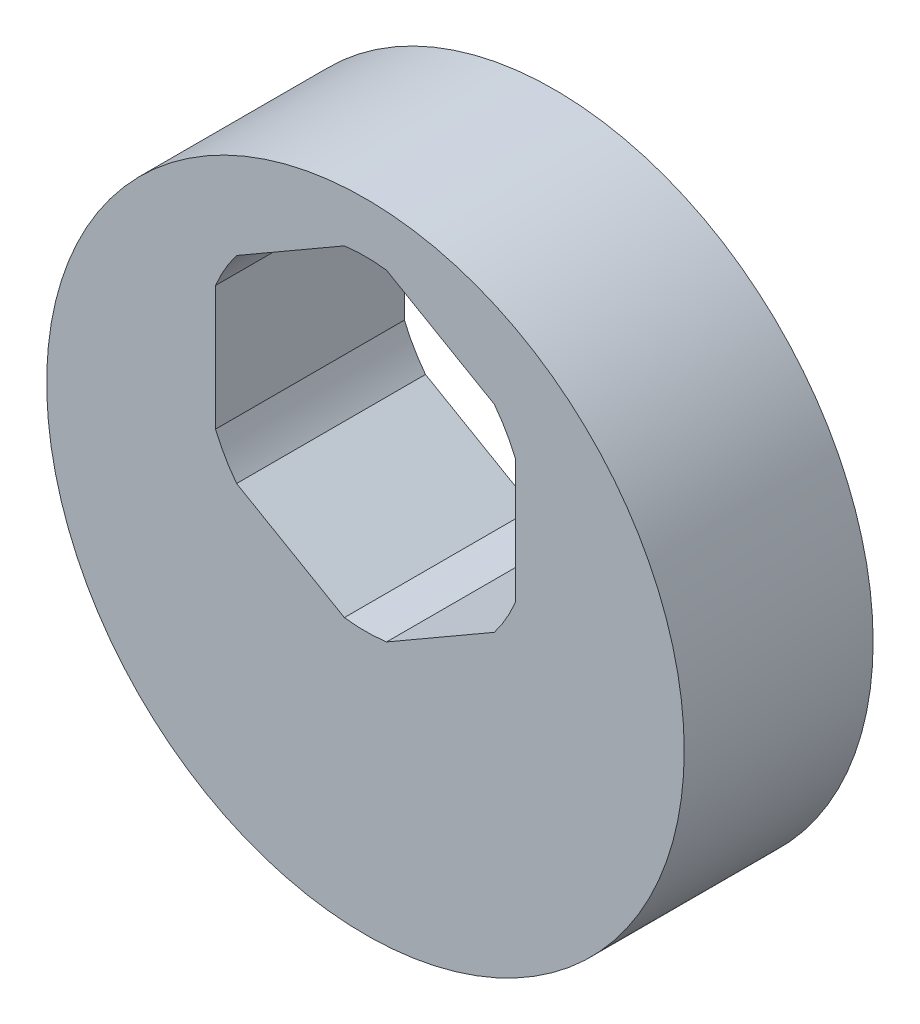
ISO-10303-21;
HEADER;
FILE_DESCRIPTION(('STEP AP214'),'2;1');
FILE_NAME('part.step','',(''),(''),'','','');
FILE_SCHEMA(('AUTOMOTIVE_DESIGN { 1 0 10303 214 1 1 1 1 }'));
ENDSEC;
DATA;
#1=APPLICATION_CONTEXT('core data for automotive mechanical design processes');
#2=APPLICATION_PROTOCOL_DEFINITION('international standard','automotive_design',2000,#1);
#3=PRODUCT_CONTEXT('',#1,'mechanical');
#4=PRODUCT('Part','Part','',(#3));
#5=PRODUCT_RELATED_PRODUCT_CATEGORY('part','',(#4));
#6=PRODUCT_DEFINITION_FORMATION('','',#4);
#7=PRODUCT_DEFINITION_CONTEXT('part definition',#1,'design');
#8=PRODUCT_DEFINITION('design','',#6,#7);
#9=PRODUCT_DEFINITION_SHAPE('','',#8);
#10=(LENGTH_UNIT() NAMED_UNIT(*) SI_UNIT(.MILLI.,.METRE.));
#11=(NAMED_UNIT(*) PLANE_ANGLE_UNIT() SI_UNIT($,.RADIAN.));
#12=(NAMED_UNIT(*) SI_UNIT($,.STERADIAN.) SOLID_ANGLE_UNIT());
#13=UNCERTAINTY_MEASURE_WITH_UNIT(LENGTH_MEASURE(1.E-05),#10,'distance_accuracy_value','');
#14=(GEOMETRIC_REPRESENTATION_CONTEXT(3) GLOBAL_UNCERTAINTY_ASSIGNED_CONTEXT((#13)) GLOBAL_UNIT_ASSIGNED_CONTEXT((#10,
#11,#12)) REPRESENTATION_CONTEXT('',''));
#15=CARTESIAN_POINT('',(0.,0.,0.));
#16=DIRECTION('',(0.,0.,1.));
#17=DIRECTION('',(1.,0.,0.));
#18=AXIS2_PLACEMENT_3D('',#15,#16,#17);
#19=CARTESIAN_POINT('',(0.,0.,4.));
#20=DIRECTION('',(0.,0.,-1.));
#21=DIRECTION('',(-1.,0.,0.));
#22=AXIS2_PLACEMENT_3D('',#19,#20,#21);
#23=CYLINDRICAL_SURFACE('',#22,13.5);
#24=CARTESIAN_POINT('',(0.,0.,4.));
#25=DIRECTION('',(0.,0.,1.));
#26=DIRECTION('',(1.,0.,0.));
#27=AXIS2_PLACEMENT_3D('',#24,#25,#26);
#28=CIRCLE('',#27,13.5);
#29=CARTESIAN_POINT('',(13.5,0.,4.));
#30=VERTEX_POINT('',#29);
#31=EDGE_CURVE('E11',#30,#30,#28,.T.);
#32=ORIENTED_EDGE('',*,*,#31,.F.);
#33=EDGE_LOOP('',(#32));
#34=FACE_BOUND('',#33,.T.);
#35=CARTESIAN_POINT('',(0.,0.,-4.));
#36=DIRECTION('',(0.,0.,1.));
#37=DIRECTION('',(1.,0.,0.));
#38=AXIS2_PLACEMENT_3D('',#35,#36,#37);
#39=CIRCLE('',#38,13.5);
#40=CARTESIAN_POINT('',(13.5,0.,-4.));
#41=VERTEX_POINT('',#40);
#42=EDGE_CURVE('E46',#41,#41,#39,.T.);
#43=ORIENTED_EDGE('',*,*,#42,.T.);
#44=EDGE_LOOP('',(#43));
#45=FACE_BOUND('',#44,.T.);
#46=ADVANCED_FACE('F43',(#34,#45),#23,.T.);
#47=CARTESIAN_POINT('',(0.,0.,4.));
#48=DIRECTION('',(0.,0.,1.));
#49=DIRECTION('',(1.,0.,0.));
#50=AXIS2_PLACEMENT_3D('',#47,#48,#49);
#51=PLANE('',#50);
#52=CARTESIAN_POINT('',(0.,4.5,4.));
#53=DIRECTION('',(0.,0.,1.));
#54=DIRECTION('',(1.,0.,0.));
#55=AXIS2_PLACEMENT_3D('',#52,#53,#54);
#56=CIRCLE('',#55,6.875);
#57=CARTESIAN_POINT('',(0.893039494206794,11.316751826331,4.));
#58=VERTEX_POINT('',#57);
#59=CARTESIAN_POINT('',(-0.893039494206795,11.316751826331,4.));
#60=VERTEX_POINT('',#59);
#61=EDGE_CURVE('E58',#58,#60,#56,.T.);
#62=ORIENTED_EDGE('',*,*,#61,.F.);
#63=DIRECTION('',(-0.866025403784438,0.5,0.));
#64=VECTOR('',#63,1.);
#65=CARTESIAN_POINT('',(5.45696050579321,8.68177080173138,4.));
#66=LINE('',#65,#64);
#67=CARTESIAN_POINT('',(5.45696050579321,8.68177080173138,4.));
#68=VERTEX_POINT('',#67);
#69=EDGE_CURVE('E154',#68,#58,#66,.T.);
#70=ORIENTED_EDGE('',*,*,#69,.F.);
#71=CARTESIAN_POINT('',(0.,4.5,4.));
#72=DIRECTION('',(0.,0.,1.));
#73=DIRECTION('',(1.,0.,0.));
#74=AXIS2_PLACEMENT_3D('',#71,#72,#73);
#75=CIRCLE('',#74,6.875);
#76=CARTESIAN_POINT('',(6.35,7.13498102459961,4.));
#77=VERTEX_POINT('',#76);
#78=EDGE_CURVE('E158',#77,#68,#75,.T.);
#79=ORIENTED_EDGE('',*,*,#78,.F.);
#80=DIRECTION('',(0.,1.,0.));
#81=VECTOR('',#80,1.);
#82=CARTESIAN_POINT('',(6.35,1.86501897540039,4.));
#83=LINE('',#82,#81);
#84=CARTESIAN_POINT('',(6.35,1.86501897540038,4.));
#85=VERTEX_POINT('',#84);
#86=EDGE_CURVE('E229',#85,#77,#83,.T.);
#87=ORIENTED_EDGE('',*,*,#86,.F.);
#88=CARTESIAN_POINT('',(0.,4.5,4.));
#89=DIRECTION('',(0.,0.,1.));
#90=DIRECTION('',(1.,0.,0.));
#91=AXIS2_PLACEMENT_3D('',#88,#89,#90);
#92=CIRCLE('',#91,6.875);
#93=CARTESIAN_POINT('',(5.45696050579321,0.318229198268621,4.));
#94=VERTEX_POINT('',#93);
#95=EDGE_CURVE('E225',#94,#85,#92,.T.);
#96=ORIENTED_EDGE('',*,*,#95,.F.);
#97=DIRECTION('',(0.866025403784439,0.5,0.));
#98=VECTOR('',#97,1.);
#99=CARTESIAN_POINT('',(0.893039494206788,-2.31675182633099,4.));
#100=LINE('',#99,#98);
#101=CARTESIAN_POINT('',(0.893039494206785,-2.31675182633099,4.));
#102=VERTEX_POINT('',#101);
#103=EDGE_CURVE('E221',#102,#94,#100,.T.);
#104=ORIENTED_EDGE('',*,*,#103,.F.);
#105=CARTESIAN_POINT('',(0.,4.5,4.));
#106=DIRECTION('',(0.,0.,1.));
#107=DIRECTION('',(1.,0.,0.));
#108=AXIS2_PLACEMENT_3D('',#105,#106,#107);
#109=CIRCLE('',#108,6.875);
#110=CARTESIAN_POINT('',(-0.893039494206787,-2.31675182633099,4.));
#111=VERTEX_POINT('',#110);
#112=EDGE_CURVE('E217',#111,#102,#109,.T.);
#113=ORIENTED_EDGE('',*,*,#112,.F.);
#114=DIRECTION('',(0.866025403784439,-0.5,0.));
#115=VECTOR('',#114,1.);
#116=CARTESIAN_POINT('',(-5.45696050579321,0.318229198268624,4.));
#117=LINE('',#116,#115);
#118=CARTESIAN_POINT('',(-5.45696050579321,0.318229198268624,4.));
#119=VERTEX_POINT('',#118);
#120=EDGE_CURVE('E213',#119,#111,#117,.T.);
#121=ORIENTED_EDGE('',*,*,#120,.F.);
#122=CARTESIAN_POINT('',(0.,4.5,4.));
#123=DIRECTION('',(0.,0.,1.));
#124=DIRECTION('',(1.,0.,0.));
#125=AXIS2_PLACEMENT_3D('',#122,#123,#124);
#126=CIRCLE('',#125,6.875);
#127=CARTESIAN_POINT('',(-6.35,1.86501897540039,4.));
#128=VERTEX_POINT('',#127);
#129=EDGE_CURVE('E209',#128,#119,#126,.T.);
#130=ORIENTED_EDGE('',*,*,#129,.F.);
#131=DIRECTION('',(0.,-1.,0.));
#132=VECTOR('',#131,1.);
#133=CARTESIAN_POINT('',(-6.35,7.13498102459961,4.));
#134=LINE('',#133,#132);
#135=CARTESIAN_POINT('',(-6.35,7.13498102459961,4.));
#136=VERTEX_POINT('',#135);
#137=EDGE_CURVE('E205',#136,#128,#134,.T.);
#138=ORIENTED_EDGE('',*,*,#137,.F.);
#139=CARTESIAN_POINT('',(0.,4.5,4.));
#140=DIRECTION('',(0.,0.,1.));
#141=DIRECTION('',(1.,0.,0.));
#142=AXIS2_PLACEMENT_3D('',#139,#140,#141);
#143=CIRCLE('',#142,6.875);
#144=CARTESIAN_POINT('',(-5.45696050579321,8.68177080173138,4.));
#145=VERTEX_POINT('',#144);
#146=EDGE_CURVE('E201',#145,#136,#143,.T.);
#147=ORIENTED_EDGE('',*,*,#146,.F.);
#148=DIRECTION('',(-0.866025403784438,-0.5,0.));
#149=VECTOR('',#148,1.);
#150=CARTESIAN_POINT('',(-0.893039494206796,11.316751826331,4.));
#151=LINE('',#150,#149);
#152=EDGE_CURVE('E198',#60,#145,#151,.T.);
#153=ORIENTED_EDGE('',*,*,#152,.F.);
#154=EDGE_LOOP('',(#62,#70,#79,#87,#96,#104,#113,#121,#130,#138,#147,#153));
#155=FACE_BOUND('',#154,.T.);
#156=ORIENTED_EDGE('',*,*,#31,.T.);
#157=EDGE_LOOP('',(#156));
#158=FACE_BOUND('',#157,.T.);
#159=ADVANCED_FACE('F271',(#155,#158),#51,.T.);
#160=CARTESIAN_POINT('',(0.,0.,-4.));
#161=DIRECTION('',(0.,0.,1.));
#162=DIRECTION('',(1.,0.,0.));
#163=AXIS2_PLACEMENT_3D('',#160,#161,#162);
#164=PLANE('',#163);
#165=DIRECTION('',(-0.866025403784438,0.5,0.));
#166=VECTOR('',#165,1.);
#167=CARTESIAN_POINT('',(5.45696050579321,8.68177080173138,-4.));
#168=LINE('',#167,#166);
#169=CARTESIAN_POINT('',(5.45696050579321,8.68177080173138,-4.));
#170=VERTEX_POINT('',#169);
#171=CARTESIAN_POINT('',(0.893039494206794,11.316751826331,-4.));
#172=VERTEX_POINT('',#171);
#173=EDGE_CURVE('E141',#170,#172,#168,.T.);
#174=ORIENTED_EDGE('',*,*,#173,.T.);
#175=CARTESIAN_POINT('',(0.,4.5,-4.));
#176=DIRECTION('',(0.,0.,1.));
#177=DIRECTION('',(1.,0.,0.));
#178=AXIS2_PLACEMENT_3D('',#175,#176,#177);
#179=CIRCLE('',#178,6.875);
#180=CARTESIAN_POINT('',(-0.893039494206796,11.316751826331,-4.));
#181=VERTEX_POINT('',#180);
#182=EDGE_CURVE('E134',#172,#181,#179,.T.);
#183=ORIENTED_EDGE('',*,*,#182,.T.);
#184=DIRECTION('',(-0.866025403784438,-0.5,0.));
#185=VECTOR('',#184,1.);
#186=CARTESIAN_POINT('',(-0.893039494206796,11.316751826331,-4.));
#187=LINE('',#186,#185);
#188=CARTESIAN_POINT('',(-5.45696050579321,8.68177080173139,-4.));
#189=VERTEX_POINT('',#188);
#190=EDGE_CURVE('E144',#181,#189,#187,.T.);
#191=ORIENTED_EDGE('',*,*,#190,.T.);
#192=CARTESIAN_POINT('',(0.,4.5,-4.));
#193=DIRECTION('',(0.,0.,1.));
#194=DIRECTION('',(1.,0.,0.));
#195=AXIS2_PLACEMENT_3D('',#192,#193,#194);
#196=CIRCLE('',#195,6.875);
#197=CARTESIAN_POINT('',(-6.35,7.13498102459961,-4.));
#198=VERTEX_POINT('',#197);
#199=EDGE_CURVE('E66',#189,#198,#196,.T.);
#200=ORIENTED_EDGE('',*,*,#199,.T.);
#201=DIRECTION('',(0.,-1.,0.));
#202=VECTOR('',#201,1.);
#203=CARTESIAN_POINT('',(-6.35,7.13498102459961,-4.));
#204=LINE('',#203,#202);
#205=CARTESIAN_POINT('',(-6.35,1.86501897540039,-4.));
#206=VERTEX_POINT('',#205);
#207=EDGE_CURVE('E163',#198,#206,#204,.T.);
#208=ORIENTED_EDGE('',*,*,#207,.T.);
#209=CARTESIAN_POINT('',(0.,4.5,-4.));
#210=DIRECTION('',(0.,0.,1.));
#211=DIRECTION('',(1.,0.,0.));
#212=AXIS2_PLACEMENT_3D('',#209,#210,#211);
#213=CIRCLE('',#212,6.875);
#214=CARTESIAN_POINT('',(-5.45696050579321,0.318229198268624,-4.));
#215=VERTEX_POINT('',#214);
#216=EDGE_CURVE('E167',#206,#215,#213,.T.);
#217=ORIENTED_EDGE('',*,*,#216,.T.);
#218=DIRECTION('',(0.866025403784439,-0.5,0.));
#219=VECTOR('',#218,1.);
#220=CARTESIAN_POINT('',(-5.45696050579321,0.318229198268624,-4.));
#221=LINE('',#220,#219);
#222=CARTESIAN_POINT('',(-0.893039494206787,-2.31675182633099,-4.));
#223=VERTEX_POINT('',#222);
#224=EDGE_CURVE('E171',#215,#223,#221,.T.);
#225=ORIENTED_EDGE('',*,*,#224,.T.);
#226=CARTESIAN_POINT('',(0.,4.5,-4.));
#227=DIRECTION('',(0.,0.,1.));
#228=DIRECTION('',(1.,0.,0.));
#229=AXIS2_PLACEMENT_3D('',#226,#227,#228);
#230=CIRCLE('',#229,6.875);
#231=CARTESIAN_POINT('',(0.893039494206785,-2.31675182633099,-4.));
#232=VERTEX_POINT('',#231);
#233=EDGE_CURVE('E175',#223,#232,#230,.T.);
#234=ORIENTED_EDGE('',*,*,#233,.T.);
#235=DIRECTION('',(0.866025403784439,0.5,0.));
#236=VECTOR('',#235,1.);
#237=CARTESIAN_POINT('',(0.893039494206788,-2.31675182633099,-4.));
#238=LINE('',#237,#236);
#239=CARTESIAN_POINT('',(5.45696050579321,0.318229198268621,-4.));
#240=VERTEX_POINT('',#239);
#241=EDGE_CURVE('E179',#232,#240,#238,.T.);
#242=ORIENTED_EDGE('',*,*,#241,.T.);
#243=CARTESIAN_POINT('',(0.,4.5,-4.));
#244=DIRECTION('',(0.,0.,1.));
#245=DIRECTION('',(1.,0.,0.));
#246=AXIS2_PLACEMENT_3D('',#243,#244,#245);
#247=CIRCLE('',#246,6.875);
#248=CARTESIAN_POINT('',(6.35,1.86501897540038,-4.));
#249=VERTEX_POINT('',#248);
#250=EDGE_CURVE('E183',#240,#249,#247,.T.);
#251=ORIENTED_EDGE('',*,*,#250,.T.);
#252=DIRECTION('',(0.,1.,0.));
#253=VECTOR('',#252,1.);
#254=CARTESIAN_POINT('',(6.35,1.86501897540039,-4.));
#255=LINE('',#254,#253);
#256=CARTESIAN_POINT('',(6.35,7.13498102459961,-4.));
#257=VERTEX_POINT('',#256);
#258=EDGE_CURVE('E187',#249,#257,#255,.T.);
#259=ORIENTED_EDGE('',*,*,#258,.T.);
#260=CARTESIAN_POINT('',(0.,4.5,-4.));
#261=DIRECTION('',(0.,0.,1.));
#262=DIRECTION('',(1.,0.,0.));
#263=AXIS2_PLACEMENT_3D('',#260,#261,#262);
#264=CIRCLE('',#263,6.875);
#265=EDGE_CURVE('E191',#257,#170,#264,.T.);
#266=ORIENTED_EDGE('',*,*,#265,.T.);
#267=EDGE_LOOP('',(#174,#183,#191,#200,#208,#217,#225,#234,#242,#251,#259,#266));
#268=FACE_BOUND('',#267,.T.);
#269=ORIENTED_EDGE('',*,*,#42,.F.);
#270=EDGE_LOOP('',(#269));
#271=FACE_BOUND('',#270,.T.);
#272=ADVANCED_FACE('F149',(#268,#271),#164,.F.);
#273=CARTESIAN_POINT('',(0.,4.5,-4.));
#274=DIRECTION('',(0.,0.,1.));
#275=DIRECTION('',(1.,0.,0.));
#276=AXIS2_PLACEMENT_3D('',#273,#274,#275);
#277=CYLINDRICAL_SURFACE('',#276,6.875);
#278=ORIENTED_EDGE('',*,*,#61,.T.);
#279=DIRECTION('',(0.,0.,1.));
#280=VECTOR('',#279,1.);
#281=CARTESIAN_POINT('',(-0.893039494206796,11.316751826331,-4.));
#282=LINE('',#281,#280);
#283=EDGE_CURVE('E130',#181,#60,#282,.T.);
#284=ORIENTED_EDGE('',*,*,#283,.F.);
#285=ORIENTED_EDGE('',*,*,#182,.F.);
#286=DIRECTION('',(0.,0.,1.));
#287=VECTOR('',#286,1.);
#288=CARTESIAN_POINT('',(0.893039494206794,11.316751826331,-4.));
#289=LINE('',#288,#287);
#290=EDGE_CURVE('E236',#172,#58,#289,.T.);
#291=ORIENTED_EDGE('',*,*,#290,.T.);
#292=EDGE_LOOP('',(#278,#284,#285,#291));
#293=FACE_BOUND('',#292,.T.);
#294=ADVANCED_FACE('F132',(#293),#277,.F.);
#295=CARTESIAN_POINT('',(5.45696050579321,8.68177080173138,-4.));
#296=DIRECTION('',(0.5,0.866025403784439,0.));
#297=DIRECTION('',(-0.866025403784439,0.5,0.));
#298=AXIS2_PLACEMENT_3D('',#295,#296,#297);
#299=PLANE('',#298);
#300=ORIENTED_EDGE('',*,*,#69,.T.);
#301=ORIENTED_EDGE('',*,*,#290,.F.);
#302=ORIENTED_EDGE('',*,*,#173,.F.);
#303=DIRECTION('',(0.,0.,1.));
#304=VECTOR('',#303,1.);
#305=CARTESIAN_POINT('',(5.45696050579321,8.68177080173138,-4.));
#306=LINE('',#305,#304);
#307=EDGE_CURVE('E239',#170,#68,#306,.T.);
#308=ORIENTED_EDGE('',*,*,#307,.T.);
#309=EDGE_LOOP('',(#300,#301,#302,#308));
#310=FACE_BOUND('',#309,.T.);
#311=ADVANCED_FACE('F306',(#310),#299,.F.);
#312=CARTESIAN_POINT('',(0.,4.5,-4.));
#313=DIRECTION('',(0.,0.,1.));
#314=DIRECTION('',(1.,0.,0.));
#315=AXIS2_PLACEMENT_3D('',#312,#313,#314);
#316=CYLINDRICAL_SURFACE('',#315,6.875);
#317=ORIENTED_EDGE('',*,*,#78,.T.);
#318=ORIENTED_EDGE('',*,*,#307,.F.);
#319=ORIENTED_EDGE('',*,*,#265,.F.);
#320=DIRECTION('',(0.,0.,1.));
#321=VECTOR('',#320,1.);
#322=CARTESIAN_POINT('',(6.35,7.13498102459961,-4.));
#323=LINE('',#322,#321);
#324=EDGE_CURVE('E242',#257,#77,#323,.T.);
#325=ORIENTED_EDGE('',*,*,#324,.T.);
#326=EDGE_LOOP('',(#317,#318,#319,#325));
#327=FACE_BOUND('',#326,.T.);
#328=ADVANCED_FACE('F302',(#327),#316,.F.);
#329=CARTESIAN_POINT('',(6.35,1.86501897540039,-4.));
#330=DIRECTION('',(1.,0.,0.));
#331=DIRECTION('',(0.,1.,0.));
#332=AXIS2_PLACEMENT_3D('',#329,#330,#331);
#333=PLANE('',#332);
#334=ORIENTED_EDGE('',*,*,#86,.T.);
#335=ORIENTED_EDGE('',*,*,#324,.F.);
#336=ORIENTED_EDGE('',*,*,#258,.F.);
#337=DIRECTION('',(0.,0.,1.));
#338=VECTOR('',#337,1.);
#339=CARTESIAN_POINT('',(6.35,1.86501897540038,-4.));
#340=LINE('',#339,#338);
#341=EDGE_CURVE('E245',#249,#85,#340,.T.);
#342=ORIENTED_EDGE('',*,*,#341,.T.);
#343=EDGE_LOOP('',(#334,#335,#336,#342));
#344=FACE_BOUND('',#343,.T.);
#345=ADVANCED_FACE('F299',(#344),#333,.F.);
#346=CARTESIAN_POINT('',(0.,4.5,-4.));
#347=DIRECTION('',(0.,0.,1.));
#348=DIRECTION('',(1.,0.,0.));
#349=AXIS2_PLACEMENT_3D('',#346,#347,#348);
#350=CYLINDRICAL_SURFACE('',#349,6.875);
#351=ORIENTED_EDGE('',*,*,#95,.T.);
#352=ORIENTED_EDGE('',*,*,#341,.F.);
#353=ORIENTED_EDGE('',*,*,#250,.F.);
#354=DIRECTION('',(0.,0.,1.));
#355=VECTOR('',#354,1.);
#356=CARTESIAN_POINT('',(5.45696050579321,0.318229198268621,-4.));
#357=LINE('',#356,#355);
#358=EDGE_CURVE('E248',#240,#94,#357,.T.);
#359=ORIENTED_EDGE('',*,*,#358,.T.);
#360=EDGE_LOOP('',(#351,#352,#353,#359));
#361=FACE_BOUND('',#360,.T.);
#362=ADVANCED_FACE('F295',(#361),#350,.F.);
#363=CARTESIAN_POINT('',(0.893039494206788,-2.31675182633099,-4.));
#364=DIRECTION('',(0.5,-0.866025403784439,0.));
#365=DIRECTION('',(0.866025403784439,0.5,0.));
#366=AXIS2_PLACEMENT_3D('',#363,#364,#365);
#367=PLANE('',#366);
#368=ORIENTED_EDGE('',*,*,#103,.T.);
#369=ORIENTED_EDGE('',*,*,#358,.F.);
#370=ORIENTED_EDGE('',*,*,#241,.F.);
#371=DIRECTION('',(0.,0.,1.));
#372=VECTOR('',#371,1.);
#373=CARTESIAN_POINT('',(0.893039494206785,-2.31675182633099,-4.));
#374=LINE('',#373,#372);
#375=EDGE_CURVE('E251',#232,#102,#374,.T.);
#376=ORIENTED_EDGE('',*,*,#375,.T.);
#377=EDGE_LOOP('',(#368,#369,#370,#376));
#378=FACE_BOUND('',#377,.T.);
#379=ADVANCED_FACE('F291',(#378),#367,.F.);
#380=CARTESIAN_POINT('',(0.,4.5,-4.));
#381=DIRECTION('',(0.,0.,1.));
#382=DIRECTION('',(1.,0.,0.));
#383=AXIS2_PLACEMENT_3D('',#380,#381,#382);
#384=CYLINDRICAL_SURFACE('',#383,6.875);
#385=ORIENTED_EDGE('',*,*,#112,.T.);
#386=ORIENTED_EDGE('',*,*,#375,.F.);
#387=ORIENTED_EDGE('',*,*,#233,.F.);
#388=DIRECTION('',(0.,0.,1.));
#389=VECTOR('',#388,1.);
#390=CARTESIAN_POINT('',(-0.893039494206787,-2.31675182633099,-4.));
#391=LINE('',#390,#389);
#392=EDGE_CURVE('E254',#223,#111,#391,.T.);
#393=ORIENTED_EDGE('',*,*,#392,.T.);
#394=EDGE_LOOP('',(#385,#386,#387,#393));
#395=FACE_BOUND('',#394,.T.);
#396=ADVANCED_FACE('F287',(#395),#384,.F.);
#397=CARTESIAN_POINT('',(-5.45696050579321,0.318229198268624,-4.));
#398=DIRECTION('',(-0.5,-0.866025403784439,0.));
#399=DIRECTION('',(0.866025403784439,-0.5,0.));
#400=AXIS2_PLACEMENT_3D('',#397,#398,#399);
#401=PLANE('',#400);
#402=ORIENTED_EDGE('',*,*,#120,.T.);
#403=ORIENTED_EDGE('',*,*,#392,.F.);
#404=ORIENTED_EDGE('',*,*,#224,.F.);
#405=DIRECTION('',(0.,0.,1.));
#406=VECTOR('',#405,1.);
#407=CARTESIAN_POINT('',(-5.45696050579321,0.318229198268624,-4.));
#408=LINE('',#407,#406);
#409=EDGE_CURVE('E257',#215,#119,#408,.T.);
#410=ORIENTED_EDGE('',*,*,#409,.T.);
#411=EDGE_LOOP('',(#402,#403,#404,#410));
#412=FACE_BOUND('',#411,.T.);
#413=ADVANCED_FACE('F283',(#412),#401,.F.);
#414=CARTESIAN_POINT('',(0.,4.5,-4.));
#415=DIRECTION('',(0.,0.,1.));
#416=DIRECTION('',(1.,0.,0.));
#417=AXIS2_PLACEMENT_3D('',#414,#415,#416);
#418=CYLINDRICAL_SURFACE('',#417,6.875);
#419=ORIENTED_EDGE('',*,*,#129,.T.);
#420=ORIENTED_EDGE('',*,*,#409,.F.);
#421=ORIENTED_EDGE('',*,*,#216,.F.);
#422=DIRECTION('',(0.,0.,1.));
#423=VECTOR('',#422,1.);
#424=CARTESIAN_POINT('',(-6.35,1.86501897540039,-4.));
#425=LINE('',#424,#423);
#426=EDGE_CURVE('E260',#206,#128,#425,.T.);
#427=ORIENTED_EDGE('',*,*,#426,.T.);
#428=EDGE_LOOP('',(#419,#420,#421,#427));
#429=FACE_BOUND('',#428,.T.);
#430=ADVANCED_FACE('F281',(#429),#418,.F.);
#431=CARTESIAN_POINT('',(-6.35,7.13498102459961,-4.));
#432=DIRECTION('',(-1.,0.,0.));
#433=DIRECTION('',(0.,-1.,0.));
#434=AXIS2_PLACEMENT_3D('',#431,#432,#433);
#435=PLANE('',#434);
#436=ORIENTED_EDGE('',*,*,#137,.T.);
#437=ORIENTED_EDGE('',*,*,#426,.F.);
#438=ORIENTED_EDGE('',*,*,#207,.F.);
#439=DIRECTION('',(0.,0.,1.));
#440=VECTOR('',#439,1.);
#441=CARTESIAN_POINT('',(-6.35,7.13498102459961,-4.));
#442=LINE('',#441,#440);
#443=EDGE_CURVE('E263',#198,#136,#442,.T.);
#444=ORIENTED_EDGE('',*,*,#443,.T.);
#445=EDGE_LOOP('',(#436,#437,#438,#444));
#446=FACE_BOUND('',#445,.T.);
#447=ADVANCED_FACE('F276',(#446),#435,.F.);
#448=CARTESIAN_POINT('',(0.,4.5,-4.));
#449=DIRECTION('',(0.,0.,1.));
#450=DIRECTION('',(1.,0.,0.));
#451=AXIS2_PLACEMENT_3D('',#448,#449,#450);
#452=CYLINDRICAL_SURFACE('',#451,6.875);
#453=ORIENTED_EDGE('',*,*,#146,.T.);
#454=ORIENTED_EDGE('',*,*,#443,.F.);
#455=ORIENTED_EDGE('',*,*,#199,.F.);
#456=DIRECTION('',(0.,0.,1.));
#457=VECTOR('',#456,1.);
#458=CARTESIAN_POINT('',(-5.45696050579321,8.68177080173138,-4.));
#459=LINE('',#458,#457);
#460=EDGE_CURVE('E140',#189,#145,#459,.T.);
#461=ORIENTED_EDGE('',*,*,#460,.T.);
#462=EDGE_LOOP('',(#453,#454,#455,#461));
#463=FACE_BOUND('',#462,.T.);
#464=ADVANCED_FACE('F267',(#463),#452,.F.);
#465=CARTESIAN_POINT('',(-0.893039494206796,11.316751826331,-4.));
#466=DIRECTION('',(-0.5,0.866025403784439,0.));
#467=DIRECTION('',(-0.866025403784439,-0.5,0.));
#468=AXIS2_PLACEMENT_3D('',#465,#466,#467);
#469=PLANE('',#468);
#470=ORIENTED_EDGE('',*,*,#152,.T.);
#471=ORIENTED_EDGE('',*,*,#460,.F.);
#472=ORIENTED_EDGE('',*,*,#190,.F.);
#473=ORIENTED_EDGE('',*,*,#283,.T.);
#474=EDGE_LOOP('',(#470,#471,#472,#473));
#475=FACE_BOUND('',#474,.T.);
#476=ADVANCED_FACE('F145',(#475),#469,.F.);
#477=CLOSED_SHELL('',(#46,#159,#272,#294,#311,#328,#345,#362,#379,#396,#413,#430,#447,#464,#476));
#478=MANIFOLD_SOLID_BREP('B2',#477);
#479=ADVANCED_BREP_SHAPE_REPRESENTATION('',(#18,#478),#14);
#480=SHAPE_DEFINITION_REPRESENTATION(#9,#479);
ENDSEC;
END-ISO-10303-21;
